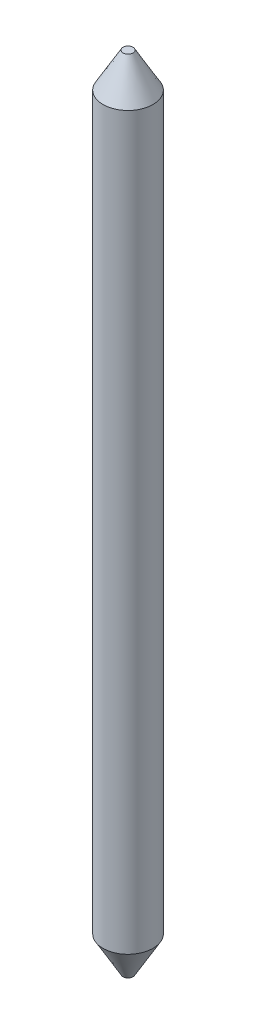
ISO-10303-21;
HEADER;
FILE_DESCRIPTION(('STEP AP214'),'2;1');
FILE_NAME('part.step','',(''),(''),'','','');
FILE_SCHEMA(('AUTOMOTIVE_DESIGN { 1 0 10303 214 1 1 1 1 }'));
ENDSEC;
DATA;
#1=APPLICATION_CONTEXT('core data for automotive mechanical design processes');
#2=APPLICATION_PROTOCOL_DEFINITION('international standard','automotive_design',2000,#1);
#3=PRODUCT_CONTEXT('',#1,'mechanical');
#4=PRODUCT('Part','Part','',(#3));
#5=PRODUCT_RELATED_PRODUCT_CATEGORY('part','',(#4));
#6=PRODUCT_DEFINITION_FORMATION('','',#4);
#7=PRODUCT_DEFINITION_CONTEXT('part definition',#1,'design');
#8=PRODUCT_DEFINITION('design','',#6,#7);
#9=PRODUCT_DEFINITION_SHAPE('','',#8);
#10=(LENGTH_UNIT() NAMED_UNIT(*) SI_UNIT(.MILLI.,.METRE.));
#11=(NAMED_UNIT(*) PLANE_ANGLE_UNIT() SI_UNIT($,.RADIAN.));
#12=(NAMED_UNIT(*) SI_UNIT($,.STERADIAN.) SOLID_ANGLE_UNIT());
#13=UNCERTAINTY_MEASURE_WITH_UNIT(LENGTH_MEASURE(1.E-05),#10,'distance_accuracy_value','');
#14=(GEOMETRIC_REPRESENTATION_CONTEXT(3) GLOBAL_UNCERTAINTY_ASSIGNED_CONTEXT((#13)) GLOBAL_UNIT_ASSIGNED_CONTEXT((#10,
#11,#12)) REPRESENTATION_CONTEXT('',''));
#15=CARTESIAN_POINT('',(0.,0.,0.));
#16=DIRECTION('',(0.,0.,1.));
#17=DIRECTION('',(1.,0.,0.));
#18=AXIS2_PLACEMENT_3D('',#15,#16,#17);
#19=CARTESIAN_POINT('',(0.,101.6,0.));
#20=DIRECTION('',(0.,-1.,0.));
#21=DIRECTION('',(0.,0.,-1.));
#22=AXIS2_PLACEMENT_3D('',#19,#20,#21);
#23=CYLINDRICAL_SURFACE('',#22,3.175);
#24=CARTESIAN_POINT('',(0.,97.200590948775,0.));
#25=DIRECTION('',(0.,1.,0.));
#26=DIRECTION('',(0.,0.,1.));
#27=AXIS2_PLACEMENT_3D('',#24,#25,#26);
#28=CIRCLE('',#27,3.175);
#29=CARTESIAN_POINT('',(0.,97.200590948775,-3.175));
#30=VERTEX_POINT('',#29);
#31=EDGE_CURVE('E37',#30,#30,#28,.T.);
#32=ORIENTED_EDGE('',*,*,#31,.F.);
#33=EDGE_LOOP('',(#32));
#34=FACE_BOUND('',#33,.T.);
#35=CARTESIAN_POINT('',(0.,4.39940905122495,0.));
#36=DIRECTION('',(0.,1.,0.));
#37=DIRECTION('',(0.,0.,1.));
#38=AXIS2_PLACEMENT_3D('',#35,#36,#37);
#39=CIRCLE('',#38,3.175);
#40=CARTESIAN_POINT('',(0.,4.39940905122495,-3.175));
#41=VERTEX_POINT('',#40);
#42=EDGE_CURVE('E45',#41,#41,#39,.T.);
#43=ORIENTED_EDGE('',*,*,#42,.T.);
#44=EDGE_LOOP('',(#43));
#45=FACE_BOUND('',#44,.T.);
#46=ADVANCED_FACE('F31',(#34,#45),#23,.T.);
#47=CARTESIAN_POINT('',(0.,101.6,0.));
#48=DIRECTION('',(0.,-1.,0.));
#49=DIRECTION('',(0.,0.,-1.));
#50=AXIS2_PLACEMENT_3D('',#47,#48,#49);
#51=CONICAL_SURFACE('',#50,0.635,0.523598775598299);
#52=CARTESIAN_POINT('',(0.,101.6,0.));
#53=DIRECTION('',(0.,1.,0.));
#54=DIRECTION('',(0.,0.,1.));
#55=AXIS2_PLACEMENT_3D('',#52,#53,#54);
#56=CIRCLE('',#55,0.635);
#57=CARTESIAN_POINT('',(0.,101.6,-0.635000000000004));
#58=VERTEX_POINT('',#57);
#59=EDGE_CURVE('E10',#58,#58,#56,.T.);
#60=CARTESIAN_POINT('',(0.,97.200590948775,-3.175));
#61=CARTESIAN_POINT('',(0.,97.246418126392,-3.14854166666667));
#62=CARTESIAN_POINT('',(0.,97.2922453040089,-3.12208333333334));
#63=CARTESIAN_POINT('',(0.,97.3838996592428,-3.06916666666667));
#64=CARTESIAN_POINT('',(0.,97.4297268368597,-3.04270833333334));
#65=CARTESIAN_POINT('',(0.,97.5213811920935,-2.98979166666667));
#66=CARTESIAN_POINT('',(0.,97.5672083697105,-2.96333333333334));
#67=CARTESIAN_POINT('',(0.,97.6588627249443,-2.91041666666667));
#68=CARTESIAN_POINT('',(0.,97.7046899025612,-2.88395833333334));
#69=CARTESIAN_POINT('',(0.,97.7963442577951,-2.83104166666667));
#70=CARTESIAN_POINT('',(0.,97.842171435412,-2.80458333333334));
#71=CARTESIAN_POINT('',(0.,97.9338257906459,-2.75166666666667));
#72=CARTESIAN_POINT('',(0.,97.9796529682628,-2.72520833333334));
#73=CARTESIAN_POINT('',(0.,98.0713073234966,-2.67229166666667));
#74=CARTESIAN_POINT('',(0.,98.1171345011136,-2.64583333333334));
#75=CARTESIAN_POINT('',(0.,98.2087888563474,-2.59291666666667));
#76=CARTESIAN_POINT('',(0.,98.2546160339644,-2.56645833333334));
#77=CARTESIAN_POINT('',(0.,98.3462703891982,-2.51354166666667));
#78=CARTESIAN_POINT('',(0.,98.3920975668151,-2.48708333333334));
#79=CARTESIAN_POINT('',(0.,98.483751922049,-2.43416666666667));
#80=CARTESIAN_POINT('',(0.,98.5295790996659,-2.40770833333334));
#81=CARTESIAN_POINT('',(0.,98.6212334548998,-2.35479166666667));
#82=CARTESIAN_POINT('',(0.,98.6670606325167,-2.32833333333334));
#83=CARTESIAN_POINT('',(0.,98.7587149877506,-2.27541666666667));
#84=CARTESIAN_POINT('',(0.,98.8045421653675,-2.24895833333334));
#85=CARTESIAN_POINT('',(0.,98.8961965206013,-2.19604166666667));
#86=CARTESIAN_POINT('',(0.,98.9420236982183,-2.16958333333334));
#87=CARTESIAN_POINT('',(0.,99.0336780534521,-2.11666666666667));
#88=CARTESIAN_POINT('',(0.,99.079505231069,-2.09020833333334));
#89=CARTESIAN_POINT('',(0.,99.1711595863029,-2.03729166666667));
#90=CARTESIAN_POINT('',(0.,99.2169867639198,-2.01083333333334));
#91=CARTESIAN_POINT('',(0.,99.3086411191537,-1.95791666666667));
#92=CARTESIAN_POINT('',(0.,99.3544682967706,-1.93145833333334));
#93=CARTESIAN_POINT('',(0.,99.4461226520044,-1.87854166666667));
#94=CARTESIAN_POINT('',(0.,99.4919498296214,-1.85208333333334));
#95=CARTESIAN_POINT('',(0.,99.5836041848552,-1.79916666666667));
#96=CARTESIAN_POINT('',(0.,99.6294313624722,-1.77270833333334));
#97=CARTESIAN_POINT('',(0.,99.721085717706,-1.71979166666667));
#98=CARTESIAN_POINT('',(0.,99.7669128953229,-1.69333333333334));
#99=CARTESIAN_POINT('',(0.,99.8585672505568,-1.64041666666667));
#100=CARTESIAN_POINT('',(0.,99.9043944281737,-1.61395833333334));
#101=CARTESIAN_POINT('',(0.,99.9960487834076,-1.56104166666667));
#102=CARTESIAN_POINT('',(0.,100.041875961024,-1.53458333333334));
#103=CARTESIAN_POINT('',(0.,100.133530316258,-1.48166666666667));
#104=CARTESIAN_POINT('',(0.,100.179357493875,-1.45520833333334));
#105=CARTESIAN_POINT('',(0.,100.271011849109,-1.40229166666667));
#106=CARTESIAN_POINT('',(0.,100.316839026726,-1.37583333333334));
#107=CARTESIAN_POINT('',(0.,100.40849338196,-1.32291666666667));
#108=CARTESIAN_POINT('',(0.,100.454320559577,-1.29645833333334));
#109=CARTESIAN_POINT('',(0.,100.545974914811,-1.24354166666667));
#110=CARTESIAN_POINT('',(0.,100.591802092428,-1.21708333333334));
#111=CARTESIAN_POINT('',(0.,100.683456447661,-1.16416666666667));
#112=CARTESIAN_POINT('',(0.,100.729283625278,-1.13770833333334));
#113=CARTESIAN_POINT('',(0.,100.820937980512,-1.08479166666667));
#114=CARTESIAN_POINT('',(0.,100.866765158129,-1.05833333333334));
#115=CARTESIAN_POINT('',(0.,100.958419513363,-1.00541666666667));
#116=CARTESIAN_POINT('',(0.,101.00424669098,-0.978958333333336));
#117=CARTESIAN_POINT('',(0.,101.095901046214,-0.92604166666667));
#118=CARTESIAN_POINT('',(0.,101.141728223831,-0.899583333333338));
#119=CARTESIAN_POINT('',(0.,101.233382579065,-0.846666666666672));
#120=CARTESIAN_POINT('',(0.,101.279209756682,-0.820208333333337));
#121=CARTESIAN_POINT('',(0.,101.370864111915,-0.767291666666669));
#122=CARTESIAN_POINT('',(0.,101.416691289532,-0.740833333333336));
#123=CARTESIAN_POINT('',(0.,101.508345644766,-0.687916666666671));
#124=CARTESIAN_POINT('',(0.,101.554172822383,-0.661458333333339));
#125=CARTESIAN_POINT('',(0.,101.6,-0.635000000000004));
#126=B_SPLINE_CURVE_WITH_KNOTS('',3,(#60,#61,#62,#63,#64,#65,#66,#67,#68,#69,#70,#71,#72,#73,
#74,#75,#76,#77,#78,#79,#80,#81,#82,#83,#84,#85,#86,#87,#88,#89,#90,#91,#92,#93,#94,#95,#96,#97,
#98,#99,#100,#101,#102,#103,#104,#105,#106,#107,#108,#109,#110,#111,#112,#113,#114,#115,#116,
#117,#118,#119,#120,#121,#122,#123,#124,#125),.UNSPECIFIED.,.F.,.F.,(4,2,2,2,2,2,2,2,2,2,2,2,2,
2,2,2,2,2,2,2,2,2,2,2,2,2,2,2,2,2,2,2,4),(0.,0.158750000000006,0.317500000000011,
0.476250000000005,0.635000000000011,0.793750000000004,0.95250000000001,1.11125,1.27000000000001,
1.42875,1.58750000000001,1.74625,1.90500000000001,2.06375,2.22250000000001,2.38125,
2.54000000000001,2.69875000000001,2.8575,3.01625000000001,3.175,3.33375000000001,3.4925,
3.65125000000001,3.81,3.96875000000001,4.1275,4.28625000000001,4.445,4.60375000000001,4.7625,
4.92125000000001,5.08000000000001),.UNSPECIFIED.);
#127=EDGE_CURVE('BSEAM65',#30,#58,#126,.T.);
#128=ORIENTED_EDGE('',*,*,#31,.T.);
#129=ORIENTED_EDGE('',*,*,#59,.F.);
#130=ORIENTED_EDGE('',*,*,#127,.T.);
#131=ORIENTED_EDGE('',*,*,#127,.F.);
#132=EDGE_LOOP('',(#128,#130,#129,#131));
#133=FACE_BOUND('',#132,.T.);
#134=ADVANCED_FACE('F65',(#133),#51,.T.);
#135=CARTESIAN_POINT('',(0.,101.6,0.));
#136=DIRECTION('',(0.,1.,0.));
#137=DIRECTION('',(0.,0.,1.));
#138=AXIS2_PLACEMENT_3D('',#135,#136,#137);
#139=PLANE('',#138);
#140=ORIENTED_EDGE('',*,*,#59,.T.);
#141=EDGE_LOOP('',(#140));
#142=FACE_BOUND('',#141,.T.);
#143=ADVANCED_FACE('F56',(#142),#139,.T.);
#144=CARTESIAN_POINT('',(0.,0.,0.));
#145=DIRECTION('',(0.,1.,0.));
#146=DIRECTION('',(0.,0.,-1.));
#147=AXIS2_PLACEMENT_3D('',#144,#145,#146);
#148=CONICAL_SURFACE('',#147,0.635,0.523598775598299);
#149=CARTESIAN_POINT('',(0.,0.,0.));
#150=DIRECTION('',(0.,1.,0.));
#151=DIRECTION('',(0.,0.,1.));
#152=AXIS2_PLACEMENT_3D('',#149,#150,#151);
#153=CIRCLE('',#152,0.635);
#154=CARTESIAN_POINT('',(0.,0.,-0.635));
#155=VERTEX_POINT('',#154);
#156=EDGE_CURVE('E41',#155,#155,#153,.T.);
#157=CARTESIAN_POINT('',(0.,4.39940905122495,-3.175));
#158=CARTESIAN_POINT('',(0.,4.35358187360802,-3.14854166666667));
#159=CARTESIAN_POINT('',(0.,4.3077546959911,-3.12208333333333));
#160=CARTESIAN_POINT('',(0.,4.21610034075724,-3.06916666666667));
#161=CARTESIAN_POINT('',(0.,4.17027316314032,-3.04270833333333));
#162=CARTESIAN_POINT('',(0.,4.07861880790646,-2.98979166666667));
#163=CARTESIAN_POINT('',(0.,4.03279163028953,-2.96333333333333));
#164=CARTESIAN_POINT('',(0.,3.94113727505568,-2.91041666666667));
#165=CARTESIAN_POINT('',(0.,3.89531009743876,-2.88395833333333));
#166=CARTESIAN_POINT('',(0.,3.8036557422049,-2.83104166666667));
#167=CARTESIAN_POINT('',(0.,3.75782856458798,-2.80458333333333));
#168=CARTESIAN_POINT('',(0.,3.66617420935412,-2.75166666666667));
#169=CARTESIAN_POINT('',(0.,3.6203470317372,-2.72520833333333));
#170=CARTESIAN_POINT('',(0.,3.52869267650334,-2.67229166666667));
#171=CARTESIAN_POINT('',(0.,3.48286549888642,-2.64583333333333));
#172=CARTESIAN_POINT('',(0.,3.39121114365256,-2.59291666666667));
#173=CARTESIAN_POINT('',(0.,3.34538396603564,-2.56645833333333));
#174=CARTESIAN_POINT('',(0.,3.25372961080178,-2.51354166666667));
#175=CARTESIAN_POINT('',(0.,3.20790243318486,-2.48708333333333));
#176=CARTESIAN_POINT('',(0.,3.116248077951,-2.43416666666667));
#177=CARTESIAN_POINT('',(0.,3.07042090033408,-2.40770833333333));
#178=CARTESIAN_POINT('',(0.,2.97876654510023,-2.35479166666667));
#179=CARTESIAN_POINT('',(0.,2.9329393674833,-2.32833333333333));
#180=CARTESIAN_POINT('',(0.,2.84128501224945,-2.27541666666667));
#181=CARTESIAN_POINT('',(0.,2.79545783463252,-2.24895833333333));
#182=CARTESIAN_POINT('',(0.,2.70380347939867,-2.19604166666667));
#183=CARTESIAN_POINT('',(0.,2.65797630178174,-2.16958333333333));
#184=CARTESIAN_POINT('',(0.,2.56632194654789,-2.11666666666667));
#185=CARTESIAN_POINT('',(0.,2.52049476893096,-2.09020833333333));
#186=CARTESIAN_POINT('',(0.,2.42884041369711,-2.03729166666667));
#187=CARTESIAN_POINT('',(0.,2.38301323608018,-2.01083333333333));
#188=CARTESIAN_POINT('',(0.,2.29135888084633,-1.95791666666667));
#189=CARTESIAN_POINT('',(0.,2.2455317032294,-1.93145833333333));
#190=CARTESIAN_POINT('',(0.,2.15387734799555,-1.87854166666667));
#191=CARTESIAN_POINT('',(0.,2.10805017037862,-1.85208333333333));
#192=CARTESIAN_POINT('',(0.,2.01639581514477,-1.79916666666667));
#193=CARTESIAN_POINT('',(0.,1.97056863752784,-1.77270833333333));
#194=CARTESIAN_POINT('',(0.,1.87891428229399,-1.71979166666667));
#195=CARTESIAN_POINT('',(0.,1.83308710467706,-1.69333333333333));
#196=CARTESIAN_POINT('',(0.,1.74143274944321,-1.64041666666667));
#197=CARTESIAN_POINT('',(0.,1.69560557182628,-1.61395833333333));
#198=CARTESIAN_POINT('',(0.,1.60395121659243,-1.56104166666667));
#199=CARTESIAN_POINT('',(0.,1.5581240389755,-1.53458333333333));
#200=CARTESIAN_POINT('',(0.,1.46646968374165,-1.48166666666667));
#201=CARTESIAN_POINT('',(0.,1.42064250612472,-1.45520833333333));
#202=CARTESIAN_POINT('',(0.,1.32898815089087,-1.40229166666667));
#203=CARTESIAN_POINT('',(0.,1.28316097327394,-1.37583333333333));
#204=CARTESIAN_POINT('',(0.,1.19150661804009,-1.32291666666667));
#205=CARTESIAN_POINT('',(0.,1.14567944042316,-1.29645833333333));
#206=CARTESIAN_POINT('',(0.,1.05402508518931,-1.24354166666667));
#207=CARTESIAN_POINT('',(0.,1.00819790757238,-1.21708333333333));
#208=CARTESIAN_POINT('',(0.,0.916543552338531,-1.16416666666667));
#209=CARTESIAN_POINT('',(0.,0.870716374721604,-1.13770833333333));
#210=CARTESIAN_POINT('',(0.,0.779062019487751,-1.08479166666667));
#211=CARTESIAN_POINT('',(0.,0.733234841870825,-1.05833333333333));
#212=CARTESIAN_POINT('',(0.,0.641580486636972,-1.00541666666667));
#213=CARTESIAN_POINT('',(0.,0.595753309020045,-0.978958333333333));
#214=CARTESIAN_POINT('',(0.,0.504098953786192,-0.926041666666667));
#215=CARTESIAN_POINT('',(0.,0.458271776169266,-0.899583333333333));
#216=CARTESIAN_POINT('',(0.,0.366617420935413,-0.846666666666667));
#217=CARTESIAN_POINT('',(0.,0.320790243318486,-0.820208333333333));
#218=CARTESIAN_POINT('',(0.,0.229135888084633,-0.767291666666667));
#219=CARTESIAN_POINT('',(0.,0.183308710467706,-0.740833333333333));
#220=CARTESIAN_POINT('',(0.,0.0916543552338528,-0.687916666666667));
#221=CARTESIAN_POINT('',(0.,0.0458271776169264,-0.661458333333333));
#222=CARTESIAN_POINT('',(0.,0.,-0.635));
#223=B_SPLINE_CURVE_WITH_KNOTS('',3,(#157,#158,#159,#160,#161,#162,#163,#164,#165,#166,#167,
#168,#169,#170,#171,#172,#173,#174,#175,#176,#177,#178,#179,#180,#181,#182,#183,#184,#185,#186,
#187,#188,#189,#190,#191,#192,#193,#194,#195,#196,#197,#198,#199,#200,#201,#202,#203,#204,#205,
#206,#207,#208,#209,#210,#211,#212,#213,#214,#215,#216,#217,#218,#219,#220,#221,#222),
.UNSPECIFIED.,.F.,.F.,(4,2,2,2,2,2,2,2,2,2,2,2,2,2,2,2,2,2,2,2,2,2,2,2,2,2,2,2,2,2,2,2,4),(0.,
0.158749999999999,0.3175,0.47625,0.635,0.79375,0.9525,1.11125,1.27,1.42875,1.5875,1.74625,1.905,
2.06375,2.2225,2.38125,2.54,2.69875,2.8575,3.01625,3.175,3.33375,3.4925,3.65125,3.81,3.96875,
4.1275,4.28625,4.445,4.60375,4.7625,4.92125,5.08),.UNSPECIFIED.);
#224=EDGE_CURVE('BSEAM52',#41,#155,#223,.T.);
#225=ORIENTED_EDGE('',*,*,#42,.F.);
#226=ORIENTED_EDGE('',*,*,#156,.T.);
#227=ORIENTED_EDGE('',*,*,#224,.T.);
#228=ORIENTED_EDGE('',*,*,#224,.F.);
#229=EDGE_LOOP('',(#225,#227,#226,#228));
#230=FACE_BOUND('',#229,.T.);
#231=ADVANCED_FACE('F52',(#230),#148,.T.);
#232=CARTESIAN_POINT('',(0.,0.,0.));
#233=DIRECTION('',(0.,1.,0.));
#234=DIRECTION('',(0.,0.,1.));
#235=AXIS2_PLACEMENT_3D('',#232,#233,#234);
#236=PLANE('',#235);
#237=ORIENTED_EDGE('',*,*,#156,.F.);
#238=EDGE_LOOP('',(#237));
#239=FACE_BOUND('',#238,.T.);
#240=ADVANCED_FACE('F55',(#239),#236,.F.);
#241=CLOSED_SHELL('',(#46,#134,#143,#231,#240));
#242=MANIFOLD_SOLID_BREP('B2',#241);
#243=ADVANCED_BREP_SHAPE_REPRESENTATION('',(#18,#242),#14);
#244=SHAPE_DEFINITION_REPRESENTATION(#9,#243);
ENDSEC;
END-ISO-10303-21;
